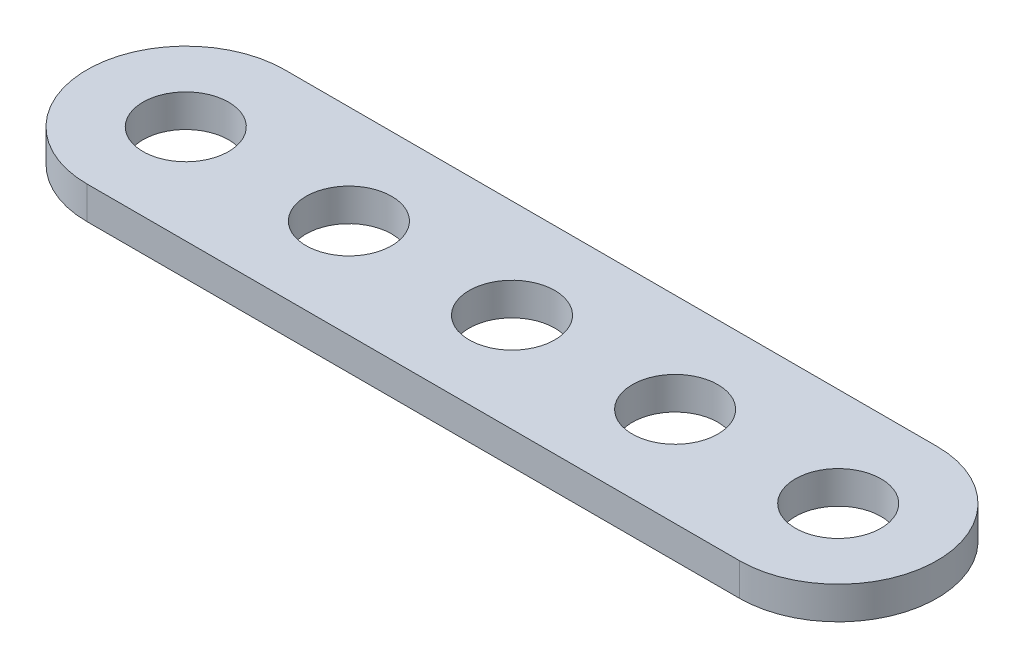
ISO-10303-21;
HEADER;
FILE_DESCRIPTION(('STEP AP214'),'2;1');
FILE_NAME('part.step','',(''),(''),'','','');
FILE_SCHEMA(('AUTOMOTIVE_DESIGN { 1 0 10303 214 1 1 1 1 }'));
ENDSEC;
DATA;
#1=APPLICATION_CONTEXT('core data for automotive mechanical design processes');
#2=APPLICATION_PROTOCOL_DEFINITION('international standard','automotive_design',2000,#1);
#3=PRODUCT_CONTEXT('',#1,'mechanical');
#4=PRODUCT('Part','Part','',(#3));
#5=PRODUCT_RELATED_PRODUCT_CATEGORY('part','',(#4));
#6=PRODUCT_DEFINITION_FORMATION('','',#4);
#7=PRODUCT_DEFINITION_CONTEXT('part definition',#1,'design');
#8=PRODUCT_DEFINITION('design','',#6,#7);
#9=PRODUCT_DEFINITION_SHAPE('','',#8);
#10=(LENGTH_UNIT() NAMED_UNIT(*) SI_UNIT(.MILLI.,.METRE.));
#11=(NAMED_UNIT(*) PLANE_ANGLE_UNIT() SI_UNIT($,.RADIAN.));
#12=(NAMED_UNIT(*) SI_UNIT($,.STERADIAN.) SOLID_ANGLE_UNIT());
#13=UNCERTAINTY_MEASURE_WITH_UNIT(LENGTH_MEASURE(1.E-05),#10,'distance_accuracy_value','');
#14=(GEOMETRIC_REPRESENTATION_CONTEXT(3) GLOBAL_UNCERTAINTY_ASSIGNED_CONTEXT((#13)) GLOBAL_UNIT_ASSIGNED_CONTEXT((#10,
#11,#12)) REPRESENTATION_CONTEXT('',''));
#15=CARTESIAN_POINT('',(0.,0.,0.));
#16=DIRECTION('',(0.,0.,1.));
#17=DIRECTION('',(1.,0.,0.));
#18=AXIS2_PLACEMENT_3D('',#15,#16,#17);
#19=CARTESIAN_POINT('',(0.,0.,0.));
#20=DIRECTION('',(0.,1.,0.));
#21=DIRECTION('',(0.,0.,1.));
#22=AXIS2_PLACEMENT_3D('',#19,#20,#21);
#23=PLANE('',#22);
#24=CARTESIAN_POINT('',(32.,0.,0.));
#25=DIRECTION('',(0.,-1.,0.));
#26=DIRECTION('',(0.,0.,-1.));
#27=AXIS2_PLACEMENT_3D('',#24,#25,#26);
#28=CIRCLE('',#27,4.85);
#29=CARTESIAN_POINT('',(32.,0.,4.85));
#30=VERTEX_POINT('',#29);
#31=CARTESIAN_POINT('',(32.,0.,-4.85));
#32=VERTEX_POINT('',#31);
#33=EDGE_CURVE('E55',#30,#32,#28,.F.);
#34=ORIENTED_EDGE('',*,*,#33,.F.);
#35=DIRECTION('',(-1.,0.,0.));
#36=VECTOR('',#35,1.);
#37=CARTESIAN_POINT('',(0.,0.,4.85));
#38=LINE('',#37,#36);
#39=CARTESIAN_POINT('',(0.,0.,4.85));
#40=VERTEX_POINT('',#39);
#41=EDGE_CURVE('E60',#30,#40,#38,.T.);
#42=ORIENTED_EDGE('',*,*,#41,.T.);
#43=CARTESIAN_POINT('',(0.,0.,0.));
#44=DIRECTION('',(0.,-1.,0.));
#45=DIRECTION('',(0.,0.,-1.));
#46=AXIS2_PLACEMENT_3D('',#43,#44,#45);
#47=CIRCLE('',#46,4.85);
#48=CARTESIAN_POINT('',(0.,0.,-4.85));
#49=VERTEX_POINT('',#48);
#50=EDGE_CURVE('E76',#49,#40,#47,.F.);
#51=ORIENTED_EDGE('',*,*,#50,.F.);
#52=DIRECTION('',(1.,0.,0.));
#53=VECTOR('',#52,1.);
#54=CARTESIAN_POINT('',(0.,0.,-4.85));
#55=LINE('',#54,#53);
#56=EDGE_CURVE('E61',#49,#32,#55,.T.);
#57=ORIENTED_EDGE('',*,*,#56,.T.);
#58=EDGE_LOOP('',(#34,#42,#51,#57));
#59=FACE_BOUND('',#58,.T.);
#60=CARTESIAN_POINT('',(0.,0.,0.));
#61=DIRECTION('',(0.,-1.,0.));
#62=DIRECTION('',(0.,0.,-1.));
#63=AXIS2_PLACEMENT_3D('',#60,#61,#62);
#64=CIRCLE('',#63,2.1);
#65=CARTESIAN_POINT('',(0.,0.,-2.1));
#66=VERTEX_POINT('',#65);
#67=EDGE_CURVE('E64',#66,#66,#64,.F.);
#68=ORIENTED_EDGE('',*,*,#67,.T.);
#69=EDGE_LOOP('',(#68));
#70=FACE_BOUND('',#69,.T.);
#71=CARTESIAN_POINT('',(24.,0.,0.));
#72=DIRECTION('',(0.,-1.,0.));
#73=DIRECTION('',(0.,0.,-1.));
#74=AXIS2_PLACEMENT_3D('',#71,#72,#73);
#75=CIRCLE('',#74,2.1);
#76=CARTESIAN_POINT('',(24.,0.,-2.1));
#77=VERTEX_POINT('',#76);
#78=EDGE_CURVE('E73',#77,#77,#75,.F.);
#79=ORIENTED_EDGE('',*,*,#78,.T.);
#80=EDGE_LOOP('',(#79));
#81=FACE_BOUND('',#80,.T.);
#82=CARTESIAN_POINT('',(8.,0.,0.));
#83=DIRECTION('',(0.,-1.,0.));
#84=DIRECTION('',(0.,0.,-1.));
#85=AXIS2_PLACEMENT_3D('',#82,#83,#84);
#86=CIRCLE('',#85,2.1);
#87=CARTESIAN_POINT('',(8.,0.,-2.1));
#88=VERTEX_POINT('',#87);
#89=EDGE_CURVE('E109',#88,#88,#86,.F.);
#90=ORIENTED_EDGE('',*,*,#89,.T.);
#91=EDGE_LOOP('',(#90));
#92=FACE_BOUND('',#91,.T.);
#93=CARTESIAN_POINT('',(16.,0.,0.));
#94=DIRECTION('',(0.,-1.,0.));
#95=DIRECTION('',(0.,0.,-1.));
#96=AXIS2_PLACEMENT_3D('',#93,#94,#95);
#97=CIRCLE('',#96,2.1);
#98=CARTESIAN_POINT('',(16.,0.,-2.1));
#99=VERTEX_POINT('',#98);
#100=EDGE_CURVE('E103',#99,#99,#97,.F.);
#101=ORIENTED_EDGE('',*,*,#100,.T.);
#102=EDGE_LOOP('',(#101));
#103=FACE_BOUND('',#102,.T.);
#104=CARTESIAN_POINT('',(32.,0.,0.));
#105=DIRECTION('',(0.,-1.,0.));
#106=DIRECTION('',(0.,0.,-1.));
#107=AXIS2_PLACEMENT_3D('',#104,#105,#106);
#108=CIRCLE('',#107,2.1);
#109=CARTESIAN_POINT('',(32.,0.,-2.1));
#110=VERTEX_POINT('',#109);
#111=EDGE_CURVE('E19',#110,#110,#108,.F.);
#112=ORIENTED_EDGE('',*,*,#111,.T.);
#113=EDGE_LOOP('',(#112));
#114=FACE_BOUND('',#113,.T.);
#115=ADVANCED_FACE('F16',(#59,#70,#81,#92,#103,#114),#23,.F.);
#116=CARTESIAN_POINT('',(32.,1.6,0.));
#117=DIRECTION('',(0.,-1.,0.));
#118=DIRECTION('',(0.,0.,-1.));
#119=AXIS2_PLACEMENT_3D('',#116,#117,#118);
#120=CYLINDRICAL_SURFACE('',#119,2.1);
#121=ORIENTED_EDGE('',*,*,#111,.F.);
#122=EDGE_LOOP('',(#121));
#123=FACE_BOUND('',#122,.T.);
#124=CARTESIAN_POINT('',(32.,1.6,0.));
#125=DIRECTION('',(0.,-1.,0.));
#126=DIRECTION('',(0.,0.,-1.));
#127=AXIS2_PLACEMENT_3D('',#124,#125,#126);
#128=CIRCLE('',#127,2.1);
#129=CARTESIAN_POINT('',(32.,1.6,-2.1));
#130=VERTEX_POINT('',#129);
#131=EDGE_CURVE('E100',#130,#130,#128,.T.);
#132=ORIENTED_EDGE('',*,*,#131,.F.);
#133=EDGE_LOOP('',(#132));
#134=FACE_BOUND('',#133,.T.);
#135=ADVANCED_FACE('F117',(#123,#134),#120,.F.);
#136=CARTESIAN_POINT('',(8.,1.6,0.));
#137=DIRECTION('',(0.,-1.,0.));
#138=DIRECTION('',(0.,0.,-1.));
#139=AXIS2_PLACEMENT_3D('',#136,#137,#138);
#140=CYLINDRICAL_SURFACE('',#139,2.1);
#141=ORIENTED_EDGE('',*,*,#89,.F.);
#142=EDGE_LOOP('',(#141));
#143=FACE_BOUND('',#142,.T.);
#144=CARTESIAN_POINT('',(8.,1.6,0.));
#145=DIRECTION('',(0.,-1.,0.));
#146=DIRECTION('',(0.,0.,-1.));
#147=AXIS2_PLACEMENT_3D('',#144,#145,#146);
#148=CIRCLE('',#147,2.1);
#149=CARTESIAN_POINT('',(8.,1.6,-2.1));
#150=VERTEX_POINT('',#149);
#151=EDGE_CURVE('E97',#150,#150,#148,.T.);
#152=ORIENTED_EDGE('',*,*,#151,.F.);
#153=EDGE_LOOP('',(#152));
#154=FACE_BOUND('',#153,.T.);
#155=ADVANCED_FACE('F120',(#143,#154),#140,.F.);
#156=CARTESIAN_POINT('',(0.,1.6,0.));
#157=DIRECTION('',(0.,-1.,0.));
#158=DIRECTION('',(0.,0.,-1.));
#159=AXIS2_PLACEMENT_3D('',#156,#157,#158);
#160=CYLINDRICAL_SURFACE('',#159,2.1);
#161=ORIENTED_EDGE('',*,*,#67,.F.);
#162=EDGE_LOOP('',(#161));
#163=FACE_BOUND('',#162,.T.);
#164=CARTESIAN_POINT('',(0.,1.6,0.));
#165=DIRECTION('',(0.,-1.,0.));
#166=DIRECTION('',(0.,0.,-1.));
#167=AXIS2_PLACEMENT_3D('',#164,#165,#166);
#168=CIRCLE('',#167,2.1);
#169=CARTESIAN_POINT('',(0.,1.6,-2.1));
#170=VERTEX_POINT('',#169);
#171=EDGE_CURVE('E94',#170,#170,#168,.T.);
#172=ORIENTED_EDGE('',*,*,#171,.F.);
#173=EDGE_LOOP('',(#172));
#174=FACE_BOUND('',#173,.T.);
#175=ADVANCED_FACE('F151',(#163,#174),#160,.F.);
#176=CARTESIAN_POINT('',(32.,1.6,0.));
#177=DIRECTION('',(0.,-1.,0.));
#178=DIRECTION('',(0.,0.,-1.));
#179=AXIS2_PLACEMENT_3D('',#176,#177,#178);
#180=CYLINDRICAL_SURFACE('',#179,4.85);
#181=ORIENTED_EDGE('',*,*,#33,.T.);
#182=DIRECTION('',(0.,1.,0.));
#183=VECTOR('',#182,1.);
#184=CARTESIAN_POINT('',(32.,1.6,-4.85));
#185=LINE('',#184,#183);
#186=CARTESIAN_POINT('',(32.,1.6,-4.85));
#187=VERTEX_POINT('',#186);
#188=EDGE_CURVE('E83',#32,#187,#185,.T.);
#189=ORIENTED_EDGE('',*,*,#188,.T.);
#190=CARTESIAN_POINT('',(32.,1.6,0.));
#191=DIRECTION('',(0.,-1.,0.));
#192=DIRECTION('',(0.,0.,-1.));
#193=AXIS2_PLACEMENT_3D('',#190,#191,#192);
#194=CIRCLE('',#193,4.85);
#195=CARTESIAN_POINT('',(32.,1.6,4.85));
#196=VERTEX_POINT('',#195);
#197=EDGE_CURVE('E70',#196,#187,#194,.F.);
#198=ORIENTED_EDGE('',*,*,#197,.F.);
#199=DIRECTION('',(0.,1.,0.));
#200=VECTOR('',#199,1.);
#201=CARTESIAN_POINT('',(32.,1.6,4.85));
#202=LINE('',#201,#200);
#203=EDGE_CURVE('E67',#196,#30,#202,.F.);
#204=ORIENTED_EDGE('',*,*,#203,.T.);
#205=EDGE_LOOP('',(#181,#189,#198,#204));
#206=FACE_BOUND('',#205,.T.);
#207=ADVANCED_FACE('F68',(#206),#180,.T.);
#208=CARTESIAN_POINT('',(0.,1.6,-4.85));
#209=DIRECTION('',(0.,0.,1.));
#210=DIRECTION('',(1.,0.,0.));
#211=AXIS2_PLACEMENT_3D('',#208,#209,#210);
#212=PLANE('',#211);
#213=DIRECTION('',(1.,0.,0.));
#214=VECTOR('',#213,1.);
#215=CARTESIAN_POINT('',(0.,1.6,-4.85));
#216=LINE('',#215,#214);
#217=CARTESIAN_POINT('',(0.,1.6,-4.85));
#218=VERTEX_POINT('',#217);
#219=EDGE_CURVE('E92',#187,#218,#216,.F.);
#220=ORIENTED_EDGE('',*,*,#219,.F.);
#221=ORIENTED_EDGE('',*,*,#188,.F.);
#222=ORIENTED_EDGE('',*,*,#56,.F.);
#223=DIRECTION('',(0.,-1.,0.));
#224=VECTOR('',#223,1.);
#225=CARTESIAN_POINT('',(0.,1.6,-4.85));
#226=LINE('',#225,#224);
#227=EDGE_CURVE('E79',#218,#49,#226,.T.);
#228=ORIENTED_EDGE('',*,*,#227,.F.);
#229=EDGE_LOOP('',(#220,#221,#222,#228));
#230=FACE_BOUND('',#229,.T.);
#231=ADVANCED_FACE('F145',(#230),#212,.F.);
#232=CARTESIAN_POINT('',(0.,1.6,0.));
#233=DIRECTION('',(0.,-1.,0.));
#234=DIRECTION('',(0.,0.,-1.));
#235=AXIS2_PLACEMENT_3D('',#232,#233,#234);
#236=CYLINDRICAL_SURFACE('',#235,4.85);
#237=ORIENTED_EDGE('',*,*,#50,.T.);
#238=DIRECTION('',(0.,1.,0.));
#239=VECTOR('',#238,1.);
#240=CARTESIAN_POINT('',(0.,1.6,4.85));
#241=LINE('',#240,#239);
#242=CARTESIAN_POINT('',(0.,1.6,4.85));
#243=VERTEX_POINT('',#242);
#244=EDGE_CURVE('E34',#40,#243,#241,.T.);
#245=ORIENTED_EDGE('',*,*,#244,.T.);
#246=CARTESIAN_POINT('',(0.,1.6,0.));
#247=DIRECTION('',(0.,-1.,0.));
#248=DIRECTION('',(0.,0.,-1.));
#249=AXIS2_PLACEMENT_3D('',#246,#247,#248);
#250=CIRCLE('',#249,4.85);
#251=EDGE_CURVE('E89',#218,#243,#250,.F.);
#252=ORIENTED_EDGE('',*,*,#251,.F.);
#253=ORIENTED_EDGE('',*,*,#227,.T.);
#254=EDGE_LOOP('',(#237,#245,#252,#253));
#255=FACE_BOUND('',#254,.T.);
#256=ADVANCED_FACE('F142',(#255),#236,.T.);
#257=CARTESIAN_POINT('',(0.,1.6,4.85));
#258=DIRECTION('',(0.,0.,-1.));
#259=DIRECTION('',(-1.,0.,0.));
#260=AXIS2_PLACEMENT_3D('',#257,#258,#259);
#261=PLANE('',#260);
#262=DIRECTION('',(1.,0.,0.));
#263=VECTOR('',#262,1.);
#264=CARTESIAN_POINT('',(0.,1.6,4.85));
#265=LINE('',#264,#263);
#266=EDGE_CURVE('E88',#243,#196,#265,.T.);
#267=ORIENTED_EDGE('',*,*,#266,.F.);
#268=ORIENTED_EDGE('',*,*,#244,.F.);
#269=ORIENTED_EDGE('',*,*,#41,.F.);
#270=ORIENTED_EDGE('',*,*,#203,.F.);
#271=EDGE_LOOP('',(#267,#268,#269,#270));
#272=FACE_BOUND('',#271,.T.);
#273=ADVANCED_FACE('F75',(#272),#261,.F.);
#274=CARTESIAN_POINT('',(24.,1.6,0.));
#275=DIRECTION('',(0.,-1.,0.));
#276=DIRECTION('',(0.,0.,-1.));
#277=AXIS2_PLACEMENT_3D('',#274,#275,#276);
#278=CYLINDRICAL_SURFACE('',#277,2.1);
#279=ORIENTED_EDGE('',*,*,#78,.F.);
#280=EDGE_LOOP('',(#279));
#281=FACE_BOUND('',#280,.T.);
#282=CARTESIAN_POINT('',(24.,1.6,0.));
#283=DIRECTION('',(0.,-1.,0.));
#284=DIRECTION('',(0.,0.,-1.));
#285=AXIS2_PLACEMENT_3D('',#282,#283,#284);
#286=CIRCLE('',#285,2.1);
#287=CARTESIAN_POINT('',(24.,1.6,-2.1));
#288=VERTEX_POINT('',#287);
#289=EDGE_CURVE('E25',#288,#288,#286,.T.);
#290=ORIENTED_EDGE('',*,*,#289,.F.);
#291=EDGE_LOOP('',(#290));
#292=FACE_BOUND('',#291,.T.);
#293=ADVANCED_FACE('F132',(#281,#292),#278,.F.);
#294=CARTESIAN_POINT('',(16.,1.6,0.));
#295=DIRECTION('',(0.,-1.,0.));
#296=DIRECTION('',(0.,0.,-1.));
#297=AXIS2_PLACEMENT_3D('',#294,#295,#296);
#298=CYLINDRICAL_SURFACE('',#297,2.1);
#299=ORIENTED_EDGE('',*,*,#100,.F.);
#300=EDGE_LOOP('',(#299));
#301=FACE_BOUND('',#300,.T.);
#302=CARTESIAN_POINT('',(16.,1.6,0.));
#303=DIRECTION('',(0.,-1.,0.));
#304=DIRECTION('',(0.,0.,-1.));
#305=AXIS2_PLACEMENT_3D('',#302,#303,#304);
#306=CIRCLE('',#305,2.1);
#307=CARTESIAN_POINT('',(16.,1.6,-2.1));
#308=VERTEX_POINT('',#307);
#309=EDGE_CURVE('E11',#308,#308,#306,.T.);
#310=ORIENTED_EDGE('',*,*,#309,.F.);
#311=EDGE_LOOP('',(#310));
#312=FACE_BOUND('',#311,.T.);
#313=ADVANCED_FACE('F125',(#301,#312),#298,.F.);
#314=CARTESIAN_POINT('',(0.,1.6,0.));
#315=DIRECTION('',(0.,1.,0.));
#316=DIRECTION('',(0.,0.,1.));
#317=AXIS2_PLACEMENT_3D('',#314,#315,#316);
#318=PLANE('',#317);
#319=ORIENTED_EDGE('',*,*,#309,.T.);
#320=EDGE_LOOP('',(#319));
#321=FACE_BOUND('',#320,.T.);
#322=ORIENTED_EDGE('',*,*,#289,.T.);
#323=EDGE_LOOP('',(#322));
#324=FACE_BOUND('',#323,.T.);
#325=ORIENTED_EDGE('',*,*,#251,.T.);
#326=ORIENTED_EDGE('',*,*,#266,.T.);
#327=ORIENTED_EDGE('',*,*,#197,.T.);
#328=ORIENTED_EDGE('',*,*,#219,.T.);
#329=EDGE_LOOP('',(#325,#326,#327,#328));
#330=FACE_BOUND('',#329,.T.);
#331=ORIENTED_EDGE('',*,*,#171,.T.);
#332=EDGE_LOOP('',(#331));
#333=FACE_BOUND('',#332,.T.);
#334=ORIENTED_EDGE('',*,*,#151,.T.);
#335=EDGE_LOOP('',(#334));
#336=FACE_BOUND('',#335,.T.);
#337=ORIENTED_EDGE('',*,*,#131,.T.);
#338=EDGE_LOOP('',(#337));
#339=FACE_BOUND('',#338,.T.);
#340=ADVANCED_FACE('F123',(#321,#324,#330,#333,#336,#339),#318,.T.);
#341=CLOSED_SHELL('',(#115,#135,#155,#175,#207,#231,#256,#273,#293,#313,#340));
#342=MANIFOLD_SOLID_BREP('B1',#341);
#343=ADVANCED_BREP_SHAPE_REPRESENTATION('',(#18,#342),#14);
#344=SHAPE_DEFINITION_REPRESENTATION(#9,#343);
ENDSEC;
END-ISO-10303-21;
